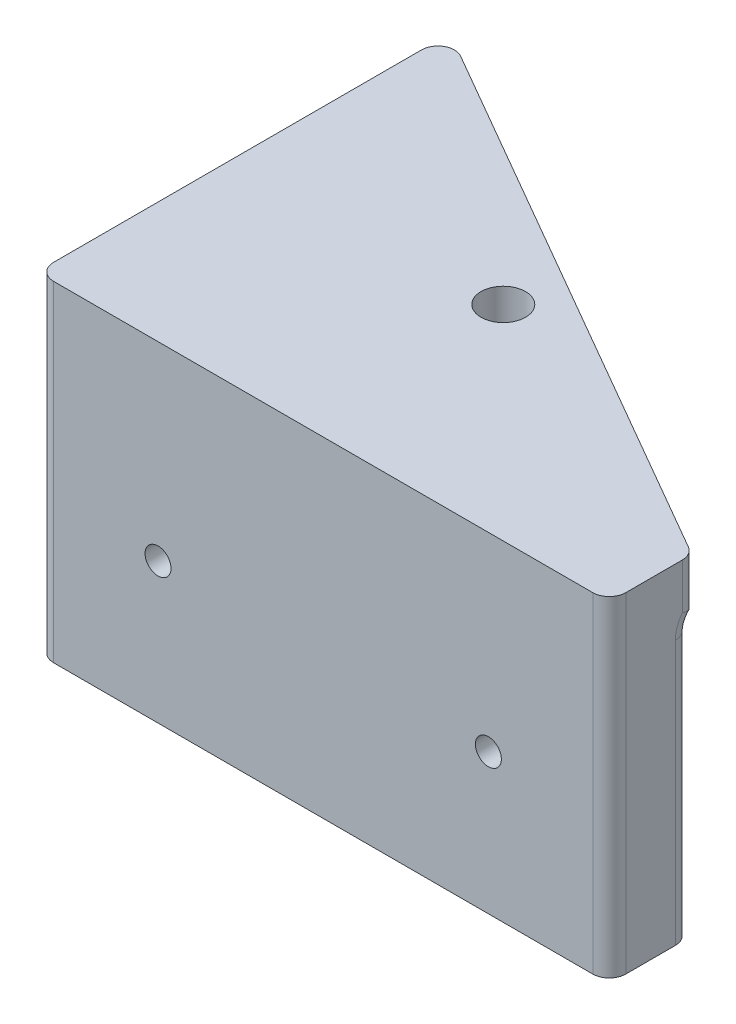
ISO-10303-21;
HEADER;
FILE_DESCRIPTION(('STEP AP214'),'2;1');
FILE_NAME('part.step','',(''),(''),'','','');
FILE_SCHEMA(('AUTOMOTIVE_DESIGN { 1 0 10303 214 1 1 1 1 }'));
ENDSEC;
DATA;
#1=APPLICATION_CONTEXT('core data for automotive mechanical design processes');
#2=APPLICATION_PROTOCOL_DEFINITION('international standard','automotive_design',2000,#1);
#3=PRODUCT_CONTEXT('',#1,'mechanical');
#4=PRODUCT('Part','Part','',(#3));
#5=PRODUCT_RELATED_PRODUCT_CATEGORY('part','',(#4));
#6=PRODUCT_DEFINITION_FORMATION('','',#4);
#7=PRODUCT_DEFINITION_CONTEXT('part definition',#1,'design');
#8=PRODUCT_DEFINITION('design','',#6,#7);
#9=PRODUCT_DEFINITION_SHAPE('','',#8);
#10=(LENGTH_UNIT() NAMED_UNIT(*) SI_UNIT(.MILLI.,.METRE.));
#11=(NAMED_UNIT(*) PLANE_ANGLE_UNIT() SI_UNIT($,.RADIAN.));
#12=(NAMED_UNIT(*) SI_UNIT($,.STERADIAN.) SOLID_ANGLE_UNIT());
#13=UNCERTAINTY_MEASURE_WITH_UNIT(LENGTH_MEASURE(1.E-05),#10,'distance_accuracy_value','');
#14=(GEOMETRIC_REPRESENTATION_CONTEXT(3) GLOBAL_UNCERTAINTY_ASSIGNED_CONTEXT((#13)) GLOBAL_UNIT_ASSIGNED_CONTEXT((#10,
#11,#12)) REPRESENTATION_CONTEXT('',''));
#15=CARTESIAN_POINT('',(0.,0.,0.));
#16=DIRECTION('',(0.,0.,1.));
#17=DIRECTION('',(1.,0.,0.));
#18=AXIS2_PLACEMENT_3D('',#15,#16,#17);
#19=CARTESIAN_POINT('',(0.,50.8,0.));
#20=DIRECTION('',(0.,1.,0.));
#21=DIRECTION('',(0.,0.,1.));
#22=AXIS2_PLACEMENT_3D('',#19,#20,#21);
#23=PLANE('',#22);
#24=DIRECTION('',(1.,0.,0.));
#25=VECTOR('',#24,1.);
#26=CARTESIAN_POINT('',(0.,50.8,0.));
#27=LINE('',#26,#25);
#28=CARTESIAN_POINT('',(2.54,50.8,0.));
#29=VERTEX_POINT('',#28);
#30=CARTESIAN_POINT('',(85.4481810244992,50.8,0.));
#31=VERTEX_POINT('',#30);
#32=EDGE_CURVE('E317',#29,#31,#27,.T.);
#33=ORIENTED_EDGE('',*,*,#32,.T.);
#34=CARTESIAN_POINT('',(85.4481810244992,50.8,-2.54));
#35=DIRECTION('',(0.,1.,0.));
#36=DIRECTION('',(0.,0.,1.));
#37=AXIS2_PLACEMENT_3D('',#34,#35,#36);
#38=CIRCLE('',#37,2.54);
#39=CARTESIAN_POINT('',(87.9881810244993,50.8,-2.54));
#40=VERTEX_POINT('',#39);
#41=EDGE_CURVE('E196',#31,#40,#38,.T.);
#42=ORIENTED_EDGE('',*,*,#41,.T.);
#43=DIRECTION('',(0.,0.,-1.));
#44=VECTOR('',#43,1.);
#45=CARTESIAN_POINT('',(87.9881810244993,50.8,0.));
#46=LINE('',#45,#44);
#47=CARTESIAN_POINT('',(87.9881810244993,50.8,-11.2335303162582));
#48=VERTEX_POINT('',#47);
#49=EDGE_CURVE('E321',#40,#48,#46,.T.);
#50=ORIENTED_EDGE('',*,*,#49,.T.);
#51=CARTESIAN_POINT('',(85.4481810244992,50.8,-11.2335303162582));
#52=DIRECTION('',(0.,1.,0.));
#53=DIRECTION('',(0.,0.,1.));
#54=AXIS2_PLACEMENT_3D('',#51,#52,#53);
#55=CIRCLE('',#54,2.54);
#56=CARTESIAN_POINT('',(86.7181810244992,50.8,-13.4332348418707));
#57=VERTEX_POINT('',#56);
#58=EDGE_CURVE('E192',#48,#57,#55,.T.);
#59=ORIENTED_EDGE('',*,*,#58,.T.);
#60=DIRECTION('',(-0.866025403784442,0.,-0.499999999999995));
#61=VECTOR('',#60,1.);
#62=CARTESIAN_POINT('',(87.9881810244993,50.8,-12.6999999999999));
#63=LINE('',#62,#61);
#64=CARTESIAN_POINT('',(3.80999999999998,50.8,-61.3002954743869));
#65=VERTEX_POINT('',#64);
#66=EDGE_CURVE('E267',#57,#65,#63,.T.);
#67=ORIENTED_EDGE('',*,*,#66,.T.);
#68=CARTESIAN_POINT('',(2.53999999999999,50.8,-59.1005909487744));
#69=DIRECTION('',(0.,1.,0.));
#70=DIRECTION('',(0.,0.,1.));
#71=AXIS2_PLACEMENT_3D('',#68,#69,#70);
#72=CIRCLE('',#71,2.54);
#73=CARTESIAN_POINT('',(0.,50.8,-59.1005909487744));
#74=VERTEX_POINT('',#73);
#75=EDGE_CURVE('E190',#65,#74,#72,.T.);
#76=ORIENTED_EDGE('',*,*,#75,.T.);
#77=DIRECTION('',(0.,0.,1.));
#78=VECTOR('',#77,1.);
#79=CARTESIAN_POINT('',(0.,50.8,-63.4999999999993));
#80=LINE('',#79,#78);
#81=CARTESIAN_POINT('',(0.,50.8,-2.54));
#82=VERTEX_POINT('',#81);
#83=EDGE_CURVE('E314',#74,#82,#80,.T.);
#84=ORIENTED_EDGE('',*,*,#83,.T.);
#85=CARTESIAN_POINT('',(2.54,50.8,-2.54));
#86=DIRECTION('',(0.,1.,0.));
#87=DIRECTION('',(0.,0.,1.));
#88=AXIS2_PLACEMENT_3D('',#85,#86,#87);
#89=CIRCLE('',#88,2.54);
#90=EDGE_CURVE('E194',#82,#29,#89,.T.);
#91=ORIENTED_EDGE('',*,*,#90,.T.);
#92=EDGE_LOOP('',(#33,#42,#50,#59,#67,#76,#84,#91));
#93=FACE_BOUND('',#92,.T.);
#94=CARTESIAN_POINT('',(40.1840905122497,50.8,-31.5008864231622));
#95=DIRECTION('',(0.,1.,0.));
#96=DIRECTION('',(0.,0.,1.));
#97=AXIS2_PLACEMENT_3D('',#94,#95,#96);
#98=CIRCLE('',#97,3.42900000000001);
#99=CARTESIAN_POINT('',(40.1840905122497,50.8,-28.0718864231622));
#100=VERTEX_POINT('',#99);
#101=EDGE_CURVE('E161',#100,#100,#98,.T.);
#102=ORIENTED_EDGE('',*,*,#101,.F.);
#103=EDGE_LOOP('',(#102));
#104=FACE_BOUND('',#103,.T.);
#105=ADVANCED_FACE('F35',(#93,#104),#23,.T.);
#106=CARTESIAN_POINT('',(0.,0.,0.));
#107=DIRECTION('',(0.,1.,0.));
#108=DIRECTION('',(0.,0.,1.));
#109=AXIS2_PLACEMENT_3D('',#106,#107,#108);
#110=PLANE('',#109);
#111=DIRECTION('',(1.,0.,0.));
#112=VECTOR('',#111,1.);
#113=CARTESIAN_POINT('',(0.,0.,-12.6999999999996));
#114=LINE('',#113,#112);
#115=CARTESIAN_POINT('',(2.54,0.,-12.6999999999996));
#116=VERTEX_POINT('',#115);
#117=CARTESIAN_POINT('',(85.4481810244992,0.,-12.6999999999997));
#118=VERTEX_POINT('',#117);
#119=EDGE_CURVE('E282',#116,#118,#114,.T.);
#120=ORIENTED_EDGE('',*,*,#119,.T.);
#121=CARTESIAN_POINT('',(85.4481810244992,0.,-10.1599999999997));
#122=DIRECTION('',(0.,1.,0.));
#123=DIRECTION('',(0.,0.,1.));
#124=AXIS2_PLACEMENT_3D('',#121,#122,#123);
#125=CIRCLE('',#124,2.54);
#126=CARTESIAN_POINT('',(87.9881810244993,0.,-10.1599999999997));
#127=VERTEX_POINT('',#126);
#128=EDGE_CURVE('E174',#118,#127,#125,.F.);
#129=ORIENTED_EDGE('',*,*,#128,.T.);
#130=DIRECTION('',(0.,0.,-1.));
#131=VECTOR('',#130,1.);
#132=CARTESIAN_POINT('',(87.9881810244993,0.,0.));
#133=LINE('',#132,#131);
#134=CARTESIAN_POINT('',(87.9881810244993,0.,-2.54));
#135=VERTEX_POINT('',#134);
#136=EDGE_CURVE('E318',#135,#127,#133,.T.);
#137=ORIENTED_EDGE('',*,*,#136,.F.);
#138=CARTESIAN_POINT('',(85.4481810244992,0.,-2.54));
#139=DIRECTION('',(0.,1.,0.));
#140=DIRECTION('',(0.,0.,1.));
#141=AXIS2_PLACEMENT_3D('',#138,#139,#140);
#142=CIRCLE('',#141,2.54);
#143=CARTESIAN_POINT('',(85.4481810244992,0.,0.));
#144=VERTEX_POINT('',#143);
#145=EDGE_CURVE('E168',#135,#144,#142,.F.);
#146=ORIENTED_EDGE('',*,*,#145,.T.);
#147=DIRECTION('',(1.,0.,0.));
#148=VECTOR('',#147,1.);
#149=CARTESIAN_POINT('',(0.,0.,0.));
#150=LINE('',#149,#148);
#151=CARTESIAN_POINT('',(2.54,0.,0.));
#152=VERTEX_POINT('',#151);
#153=EDGE_CURVE('E160',#152,#144,#150,.T.);
#154=ORIENTED_EDGE('',*,*,#153,.F.);
#155=CARTESIAN_POINT('',(2.54,0.,-2.54));
#156=DIRECTION('',(0.,1.,0.));
#157=DIRECTION('',(0.,0.,1.));
#158=AXIS2_PLACEMENT_3D('',#155,#156,#157);
#159=CIRCLE('',#158,2.54);
#160=CARTESIAN_POINT('',(0.,0.,-2.54));
#161=VERTEX_POINT('',#160);
#162=EDGE_CURVE('E159',#152,#161,#159,.F.);
#163=ORIENTED_EDGE('',*,*,#162,.T.);
#164=DIRECTION('',(0.,0.,1.));
#165=VECTOR('',#164,1.);
#166=CARTESIAN_POINT('',(0.,0.,-63.4999999999993));
#167=LINE('',#166,#165);
#168=CARTESIAN_POINT('',(0.,0.,-10.1599999999996));
#169=VERTEX_POINT('',#168);
#170=EDGE_CURVE('E142',#169,#161,#167,.T.);
#171=ORIENTED_EDGE('',*,*,#170,.F.);
#172=CARTESIAN_POINT('',(2.54,0.,-10.1599999999996));
#173=DIRECTION('',(0.,1.,0.));
#174=DIRECTION('',(0.,0.,1.));
#175=AXIS2_PLACEMENT_3D('',#172,#173,#174);
#176=CIRCLE('',#175,2.54);
#177=EDGE_CURVE('E156',#169,#116,#176,.F.);
#178=ORIENTED_EDGE('',*,*,#177,.T.);
#179=EDGE_LOOP('',(#120,#129,#137,#146,#154,#163,#171,#178));
#180=FACE_BOUND('',#179,.T.);
#181=ADVANCED_FACE('F155',(#180),#110,.F.);
#182=CARTESIAN_POINT('',(0.,50.8,-63.4999999999993));
#183=DIRECTION('',(1.,0.,0.));
#184=DIRECTION('',(0.,0.,-1.));
#185=AXIS2_PLACEMENT_3D('',#182,#183,#184);
#186=PLANE('',#185);
#187=ORIENTED_EDGE('',*,*,#170,.T.);
#188=DIRECTION('',(0.,-1.,0.));
#189=VECTOR('',#188,1.);
#190=CARTESIAN_POINT('',(0.,50.8,-2.54));
#191=LINE('',#190,#189);
#192=EDGE_CURVE('E151',#161,#82,#191,.F.);
#193=ORIENTED_EDGE('',*,*,#192,.T.);
#194=ORIENTED_EDGE('',*,*,#83,.F.);
#195=DIRECTION('',(0.,-1.,0.));
#196=VECTOR('',#195,1.);
#197=CARTESIAN_POINT('',(0.,50.8,-59.1005909487744));
#198=LINE('',#197,#196);
#199=CARTESIAN_POINT('',(0.,45.72,-59.1005909487744));
#200=VERTEX_POINT('',#199);
#201=EDGE_CURVE('E264',#74,#200,#198,.T.);
#202=ORIENTED_EDGE('',*,*,#201,.T.);
#203=DIRECTION('',(0.,0.,1.));
#204=VECTOR('',#203,1.);
#205=CARTESIAN_POINT('',(0.,45.72,-63.4999999999993));
#206=LINE('',#205,#204);
#207=CARTESIAN_POINT('',(0.,45.72,-15.2399999999996));
#208=VERTEX_POINT('',#207);
#209=EDGE_CURVE('E259',#200,#208,#206,.T.);
#210=ORIENTED_EDGE('',*,*,#209,.T.);
#211=CARTESIAN_POINT('',(0.,40.64,-15.2399999999996));
#212=DIRECTION('',(1.,0.,0.));
#213=DIRECTION('',(0.,0.,-1.));
#214=AXIS2_PLACEMENT_3D('',#211,#212,#213);
#215=CIRCLE('',#214,5.08);
#216=CARTESIAN_POINT('',(0.,40.64,-10.1599999999996));
#217=VERTEX_POINT('',#216);
#218=EDGE_CURVE('E146',#217,#208,#215,.F.);
#219=ORIENTED_EDGE('',*,*,#218,.F.);
#220=DIRECTION('',(0.,-1.,0.));
#221=VECTOR('',#220,1.);
#222=CARTESIAN_POINT('',(0.,50.8,-10.1599999999996));
#223=LINE('',#222,#221);
#224=EDGE_CURVE('E139',#217,#169,#223,.T.);
#225=ORIENTED_EDGE('',*,*,#224,.T.);
#226=EDGE_LOOP('',(#187,#193,#194,#202,#210,#219,#225));
#227=FACE_BOUND('',#226,.T.);
#228=ADVANCED_FACE('F141',(#227),#186,.F.);
#229=CARTESIAN_POINT('',(0.,50.8,0.));
#230=DIRECTION('',(0.,0.,-1.));
#231=DIRECTION('',(-1.,0.,0.));
#232=AXIS2_PLACEMENT_3D('',#229,#230,#231);
#233=PLANE('',#232);
#234=CARTESIAN_POINT('',(69.3940905122496,21.59,0.));
#235=DIRECTION('',(0.,0.,-1.));
#236=DIRECTION('',(-1.,0.,0.));
#237=AXIS2_PLACEMENT_3D('',#234,#235,#236);
#238=CIRCLE('',#237,2.);
#239=CARTESIAN_POINT('',(67.3940905122496,21.59,0.));
#240=VERTEX_POINT('',#239);
#241=EDGE_CURVE('E294',#240,#240,#238,.T.);
#242=ORIENTED_EDGE('',*,*,#241,.T.);
#243=EDGE_LOOP('',(#242));
#244=FACE_BOUND('',#243,.T.);
#245=CARTESIAN_POINT('',(18.5940905122496,21.59,0.));
#246=DIRECTION('',(0.,0.,-1.));
#247=DIRECTION('',(-1.,0.,0.));
#248=AXIS2_PLACEMENT_3D('',#245,#246,#247);
#249=CIRCLE('',#248,2.);
#250=CARTESIAN_POINT('',(16.5940905122496,21.59,0.));
#251=VERTEX_POINT('',#250);
#252=EDGE_CURVE('E302',#251,#251,#249,.T.);
#253=ORIENTED_EDGE('',*,*,#252,.T.);
#254=EDGE_LOOP('',(#253));
#255=FACE_BOUND('',#254,.T.);
#256=ORIENTED_EDGE('',*,*,#153,.T.);
#257=DIRECTION('',(0.,-1.,0.));
#258=VECTOR('',#257,1.);
#259=CARTESIAN_POINT('',(85.4481810244992,50.8,0.));
#260=LINE('',#259,#258);
#261=EDGE_CURVE('E188',#144,#31,#260,.F.);
#262=ORIENTED_EDGE('',*,*,#261,.T.);
#263=ORIENTED_EDGE('',*,*,#32,.F.);
#264=DIRECTION('',(0.,-1.,0.));
#265=VECTOR('',#264,1.);
#266=CARTESIAN_POINT('',(2.54,50.8,0.));
#267=LINE('',#266,#265);
#268=EDGE_CURVE('E185',#29,#152,#267,.T.);
#269=ORIENTED_EDGE('',*,*,#268,.T.);
#270=EDGE_LOOP('',(#256,#262,#263,#269));
#271=FACE_BOUND('',#270,.T.);
#272=ADVANCED_FACE('F355',(#244,#255,#271),#233,.F.);
#273=CARTESIAN_POINT('',(87.9881810244993,50.8,0.));
#274=DIRECTION('',(-1.,0.,0.));
#275=DIRECTION('',(0.,0.,1.));
#276=AXIS2_PLACEMENT_3D('',#273,#274,#275);
#277=PLANE('',#276);
#278=ORIENTED_EDGE('',*,*,#49,.F.);
#279=DIRECTION('',(0.,-1.,0.));
#280=VECTOR('',#279,1.);
#281=CARTESIAN_POINT('',(87.9881810244993,50.8,-2.54));
#282=LINE('',#281,#280);
#283=EDGE_CURVE('E182',#40,#135,#282,.T.);
#284=ORIENTED_EDGE('',*,*,#283,.T.);
#285=ORIENTED_EDGE('',*,*,#136,.T.);
#286=DIRECTION('',(0.,-1.,0.));
#287=VECTOR('',#286,1.);
#288=CARTESIAN_POINT('',(87.9881810244993,50.8,-10.1599999999997));
#289=LINE('',#288,#287);
#290=CARTESIAN_POINT('',(87.9881810244993,40.64,-10.1599999999997));
#291=VERTEX_POINT('',#290);
#292=EDGE_CURVE('E180',#127,#291,#289,.F.);
#293=ORIENTED_EDGE('',*,*,#292,.T.);
#294=CARTESIAN_POINT('',(87.9881810244993,40.64,-15.2399999999997));
#295=DIRECTION('',(-1.,0.,0.));
#296=DIRECTION('',(0.,0.,1.));
#297=AXIS2_PLACEMENT_3D('',#294,#295,#296);
#298=CIRCLE('',#297,5.08);
#299=CARTESIAN_POINT('',(87.9881810244993,43.7632356096299,-11.2335303162582));
#300=VERTEX_POINT('',#299);
#301=EDGE_CURVE('E178',#291,#300,#298,.T.);
#302=ORIENTED_EDGE('',*,*,#301,.T.);
#303=DIRECTION('',(0.,-1.,0.));
#304=VECTOR('',#303,1.);
#305=CARTESIAN_POINT('',(87.9881810244993,50.8,-11.2335303162582));
#306=LINE('',#305,#304);
#307=EDGE_CURVE('E176',#300,#48,#306,.F.);
#308=ORIENTED_EDGE('',*,*,#307,.T.);
#309=EDGE_LOOP('',(#278,#284,#285,#293,#302,#308));
#310=FACE_BOUND('',#309,.T.);
#311=ADVANCED_FACE('F353',(#310),#277,.F.);
#312=CARTESIAN_POINT('',(87.9881810244993,50.8,-12.6999999999999));
#313=DIRECTION('',(-0.499999999999995,0.,0.866025403784442));
#314=DIRECTION('',(0.866025403784442,0.,0.499999999999995));
#315=AXIS2_PLACEMENT_3D('',#312,#313,#314);
#316=PLANE('',#315);
#317=ORIENTED_EDGE('',*,*,#66,.F.);
#318=DIRECTION('',(0.,-1.,0.));
#319=VECTOR('',#318,1.);
#320=CARTESIAN_POINT('',(86.7181810244992,50.8,-13.4332348418707));
#321=LINE('',#320,#319);
#322=CARTESIAN_POINT('',(86.7181810244992,43.18,-13.4332348418707));
#323=VERTEX_POINT('',#322);
#324=EDGE_CURVE('E200',#57,#323,#321,.T.);
#325=ORIENTED_EDGE('',*,*,#324,.T.);
#326=DIRECTION('',(0.,-1.,0.));
#327=VECTOR('',#326,1.);
#328=CARTESIAN_POINT('',(86.7181810244992,50.8,-13.4332348418707));
#329=LINE('',#328,#327);
#330=CARTESIAN_POINT('',(86.7181810244992,42.8831454886272,-13.4332348418707));
#331=VERTEX_POINT('',#330);
#332=EDGE_CURVE('E45',#323,#331,#329,.T.);
#333=ORIENTED_EDGE('',*,*,#332,.T.);
#334=CARTESIAN_POINT('',(86.7181810244992,42.8831454886272,-13.4332348418707));
#335=CARTESIAN_POINT('',(86.6452460534976,42.8629788052658,-13.4753438670118));
#336=CARTESIAN_POINT('',(86.5713400503954,42.8485134649241,-13.5180135177976));
#337=CARTESIAN_POINT('',(86.4228672570093,42.8292855963533,-13.6037343250264));
#338=CARTESIAN_POINT('',(86.3483044674593,42.8244831587943,-13.6467831716446));
#339=CARTESIAN_POINT('',(86.2002711005633,42.8227559070771,-13.7322502758711));
#340=CARTESIAN_POINT('',(86.1268005131077,42.8257168018723,-13.7746685393161));
#341=CARTESIAN_POINT('',(85.9801911965526,42.8377806516813,-13.8593134676949));
#342=CARTESIAN_POINT('',(85.9070528276112,42.8468891582399,-13.9015399246913));
#343=CARTESIAN_POINT('',(85.7695700632303,42.8687834759007,-13.9809156357155));
#344=CARTESIAN_POINT('',(85.7051601774449,42.8810416779184,-14.0181027006122));
#345=CARTESIAN_POINT('',(85.5764551369388,42.9090338510272,-14.0924105903945));
#346=CARTESIAN_POINT('',(85.5121636963692,42.9247907419927,-14.1295292709139));
#347=CARTESIAN_POINT('',(85.4481810244992,42.9419845047425,-14.1664696837415));
#348=B_SPLINE_CURVE_WITH_KNOTS('',3,(#334,#335,#336,#337,#338,#339,#340,#341,#342,#343,#344,
#345,#346,#347),.UNSPECIFIED.,.F.,.F.,(4,2,2,2,2,2,4),(0.,0.259262787841385,0.517452562734878,
0.77186270814214,1.02650290425092,1.25255689491902,1.48013790736877),.UNSPECIFIED.);
#349=CARTESIAN_POINT('',(85.4481810244992,42.9419845047425,-14.1664696837415));
#350=VERTEX_POINT('',#349);
#351=EDGE_CURVE('E51',#331,#350,#348,.T.);
#352=ORIENTED_EDGE('',*,*,#351,.T.);
#353=CARTESIAN_POINT('',(83.5887719732746,40.64,-15.2399999999997));
#354=DIRECTION('',(-0.499999999999995,0.,0.866025403784442));
#355=DIRECTION('',(-0.866025403784442,0.,-0.499999999999995));
#356=AXIS2_PLACEMENT_3D('',#353,#354,#355);
#357=ELLIPSE('',#356,5.08000000000004,2.54);
#358=CARTESIAN_POINT('',(83.5887719732746,43.18,-15.2399999999997));
#359=VERTEX_POINT('',#358);
#360=EDGE_CURVE('E11',#350,#359,#357,.T.);
#361=ORIENTED_EDGE('',*,*,#360,.T.);
#362=DIRECTION('',(-0.866025403784442,0.,-0.499999999999995));
#363=VECTOR('',#362,1.);
#364=CARTESIAN_POINT('',(87.9881810244993,43.18,-12.6999999999999));
#365=LINE('',#364,#363);
#366=CARTESIAN_POINT('',(3.80999999999998,43.18,-61.3002954743869));
#367=VERTEX_POINT('',#366);
#368=EDGE_CURVE('E309',#359,#367,#365,.T.);
#369=ORIENTED_EDGE('',*,*,#368,.T.);
#370=DIRECTION('',(0.,-1.,0.));
#371=VECTOR('',#370,1.);
#372=CARTESIAN_POINT('',(3.80999999999998,50.8,-61.3002954743869));
#373=LINE('',#372,#371);
#374=EDGE_CURVE('E198',#367,#65,#373,.F.);
#375=ORIENTED_EDGE('',*,*,#374,.T.);
#376=EDGE_LOOP('',(#317,#325,#333,#352,#361,#369,#375));
#377=FACE_BOUND('',#376,.T.);
#378=ADVANCED_FACE('F338',(#377),#316,.F.);
#379=CARTESIAN_POINT('',(40.1840905122497,50.8,-31.5008864231622));
#380=DIRECTION('',(0.,-1.,0.));
#381=DIRECTION('',(0.,0.,-1.));
#382=AXIS2_PLACEMENT_3D('',#379,#380,#381);
#383=CYLINDRICAL_SURFACE('',#382,3.42900000000001);
#384=CARTESIAN_POINT('',(40.1840905122497,43.18,-31.5008864231622));
#385=DIRECTION('',(0.,1.,0.));
#386=DIRECTION('',(0.,0.,1.));
#387=AXIS2_PLACEMENT_3D('',#384,#385,#386);
#388=CIRCLE('',#387,3.42900000000001);
#389=CARTESIAN_POINT('',(40.1840905122497,43.18,-28.0718864231622));
#390=VERTEX_POINT('',#389);
#391=EDGE_CURVE('E308',#390,#390,#388,.T.);
#392=ORIENTED_EDGE('',*,*,#391,.F.);
#393=EDGE_LOOP('',(#392));
#394=FACE_BOUND('',#393,.T.);
#395=ORIENTED_EDGE('',*,*,#101,.T.);
#396=EDGE_LOOP('',(#395));
#397=FACE_BOUND('',#396,.T.);
#398=ADVANCED_FACE('F335',(#394,#397),#383,.F.);
#399=CARTESIAN_POINT('',(0.,43.18,-12.6999999999996));
#400=DIRECTION('',(0.,1.,0.));
#401=DIRECTION('',(0.,0.,1.));
#402=AXIS2_PLACEMENT_3D('',#399,#400,#401);
#403=PLANE('',#402);
#404=ORIENTED_EDGE('',*,*,#391,.T.);
#405=EDGE_LOOP('',(#404));
#406=FACE_BOUND('',#405,.T.);
#407=DIRECTION('',(0.,0.,1.));
#408=VECTOR('',#407,1.);
#409=CARTESIAN_POINT('',(2.54,43.18,-12.6999999999996));
#410=LINE('',#409,#408);
#411=CARTESIAN_POINT('',(2.54,43.18,-15.2399999999996));
#412=VERTEX_POINT('',#411);
#413=CARTESIAN_POINT('',(2.53999999999999,43.18,-61.6405909487744));
#414=VERTEX_POINT('',#413);
#415=EDGE_CURVE('E260',#412,#414,#410,.F.);
#416=ORIENTED_EDGE('',*,*,#415,.T.);
#417=CARTESIAN_POINT('',(2.53999999999999,43.18,-59.1005909487744));
#418=DIRECTION('',(0.,1.,0.));
#419=DIRECTION('',(0.,0.,1.));
#420=AXIS2_PLACEMENT_3D('',#417,#418,#419);
#421=CIRCLE('',#420,2.54);
#422=EDGE_CURVE('E275',#414,#367,#421,.F.);
#423=ORIENTED_EDGE('',*,*,#422,.T.);
#424=ORIENTED_EDGE('',*,*,#368,.F.);
#425=DIRECTION('',(1.,0.,0.));
#426=VECTOR('',#425,1.);
#427=CARTESIAN_POINT('',(0.,43.18,-15.2399999999996));
#428=LINE('',#427,#426);
#429=EDGE_CURVE('E272',#359,#412,#428,.F.);
#430=ORIENTED_EDGE('',*,*,#429,.T.);
#431=EDGE_LOOP('',(#416,#423,#424,#430));
#432=FACE_BOUND('',#431,.T.);
#433=ADVANCED_FACE('F332',(#406,#432),#403,.F.);
#434=CARTESIAN_POINT('',(0.,43.18,-12.6999999999996));
#435=DIRECTION('',(0.,0.,1.));
#436=DIRECTION('',(1.,0.,0.));
#437=AXIS2_PLACEMENT_3D('',#434,#435,#436);
#438=PLANE('',#437);
#439=CARTESIAN_POINT('',(69.3940905122496,21.59,-12.6999999999997));
#440=DIRECTION('',(0.,0.,-1.));
#441=DIRECTION('',(-1.,0.,0.));
#442=AXIS2_PLACEMENT_3D('',#439,#440,#441);
#443=CIRCLE('',#442,2.);
#444=CARTESIAN_POINT('',(67.3940905122496,21.59,-12.6999999999997));
#445=VERTEX_POINT('',#444);
#446=EDGE_CURVE('E292',#445,#445,#443,.T.);
#447=ORIENTED_EDGE('',*,*,#446,.F.);
#448=EDGE_LOOP('',(#447));
#449=FACE_BOUND('',#448,.T.);
#450=CARTESIAN_POINT('',(18.5940905122496,21.59,-12.6999999999996));
#451=DIRECTION('',(0.,0.,-1.));
#452=DIRECTION('',(-1.,0.,0.));
#453=AXIS2_PLACEMENT_3D('',#450,#451,#452);
#454=CIRCLE('',#453,2.);
#455=CARTESIAN_POINT('',(16.5940905122496,21.59,-12.6999999999996));
#456=VERTEX_POINT('',#455);
#457=EDGE_CURVE('E299',#456,#456,#454,.T.);
#458=ORIENTED_EDGE('',*,*,#457,.F.);
#459=EDGE_LOOP('',(#458));
#460=FACE_BOUND('',#459,.T.);
#461=DIRECTION('',(1.,0.,0.));
#462=VECTOR('',#461,1.);
#463=CARTESIAN_POINT('',(87.9881810244993,40.64,-12.6999999999997));
#464=LINE('',#463,#462);
#465=CARTESIAN_POINT('',(2.54,40.64,-12.6999999999996));
#466=VERTEX_POINT('',#465);
#467=CARTESIAN_POINT('',(85.4481810244992,40.64,-12.6999999999997));
#468=VERTEX_POINT('',#467);
#469=EDGE_CURVE('E277',#466,#468,#464,.T.);
#470=ORIENTED_EDGE('',*,*,#469,.T.);
#471=DIRECTION('',(0.,-1.,0.));
#472=VECTOR('',#471,1.);
#473=CARTESIAN_POINT('',(85.4481810244992,43.18,-12.6999999999997));
#474=LINE('',#473,#472);
#475=EDGE_CURVE('E166',#468,#118,#474,.T.);
#476=ORIENTED_EDGE('',*,*,#475,.T.);
#477=ORIENTED_EDGE('',*,*,#119,.F.);
#478=DIRECTION('',(0.,-1.,0.));
#479=VECTOR('',#478,1.);
#480=CARTESIAN_POINT('',(2.54,43.18,-12.6999999999996));
#481=LINE('',#480,#479);
#482=EDGE_CURVE('E165',#116,#466,#481,.F.);
#483=ORIENTED_EDGE('',*,*,#482,.T.);
#484=EDGE_LOOP('',(#470,#476,#477,#483));
#485=FACE_BOUND('',#484,.T.);
#486=ADVANCED_FACE('F280',(#449,#460,#485),#438,.F.);
#487=CARTESIAN_POINT('',(18.5940905122496,21.59,0.));
#488=DIRECTION('',(0.,0.,-1.));
#489=DIRECTION('',(-1.,0.,0.));
#490=AXIS2_PLACEMENT_3D('',#487,#488,#489);
#491=CYLINDRICAL_SURFACE('',#490,2.);
#492=ORIENTED_EDGE('',*,*,#252,.F.);
#493=EDGE_LOOP('',(#492));
#494=FACE_BOUND('',#493,.T.);
#495=ORIENTED_EDGE('',*,*,#457,.T.);
#496=EDGE_LOOP('',(#495));
#497=FACE_BOUND('',#496,.T.);
#498=ADVANCED_FACE('F400',(#494,#497),#491,.F.);
#499=CARTESIAN_POINT('',(69.3940905122496,21.59,0.));
#500=DIRECTION('',(0.,0.,-1.));
#501=DIRECTION('',(-1.,0.,0.));
#502=AXIS2_PLACEMENT_3D('',#499,#500,#501);
#503=CYLINDRICAL_SURFACE('',#502,2.);
#504=ORIENTED_EDGE('',*,*,#241,.F.);
#505=EDGE_LOOP('',(#504));
#506=FACE_BOUND('',#505,.T.);
#507=ORIENTED_EDGE('',*,*,#446,.T.);
#508=EDGE_LOOP('',(#507));
#509=FACE_BOUND('',#508,.T.);
#510=ADVANCED_FACE('F395',(#506,#509),#503,.F.);
#511=CARTESIAN_POINT('',(85.4481810244992,43.18,-10.1599999999997));
#512=DIRECTION('',(0.,-1.,0.));
#513=DIRECTION('',(0.,0.,-1.));
#514=AXIS2_PLACEMENT_3D('',#511,#512,#513);
#515=CYLINDRICAL_SURFACE('',#514,2.54);
#516=ORIENTED_EDGE('',*,*,#128,.F.);
#517=ORIENTED_EDGE('',*,*,#475,.F.);
#518=CARTESIAN_POINT('',(85.4481810244992,40.64,-10.1599999999997));
#519=DIRECTION('',(0.,1.,0.));
#520=DIRECTION('',(0.,0.,1.));
#521=AXIS2_PLACEMENT_3D('',#518,#519,#520);
#522=CIRCLE('',#521,2.54);
#523=EDGE_CURVE('E39',#291,#468,#522,.T.);
#524=ORIENTED_EDGE('',*,*,#523,.F.);
#525=ORIENTED_EDGE('',*,*,#292,.F.);
#526=EDGE_LOOP('',(#516,#517,#524,#525));
#527=FACE_BOUND('',#526,.T.);
#528=ADVANCED_FACE('F393',(#527),#515,.T.);
#529=CARTESIAN_POINT('',(85.4481810244992,50.8,-11.2335303162582));
#530=DIRECTION('',(0.,-1.,0.));
#531=DIRECTION('',(0.,0.,-1.));
#532=AXIS2_PLACEMENT_3D('',#529,#530,#531);
#533=CYLINDRICAL_SURFACE('',#532,2.54);
#534=ORIENTED_EDGE('',*,*,#58,.F.);
#535=ORIENTED_EDGE('',*,*,#307,.F.);
#536=CARTESIAN_POINT('',(86.7181810244992,42.8831454886272,-13.4332348418707));
#537=CARTESIAN_POINT('',(86.7825228804878,42.9009265920222,-13.3960848729693));
#538=CARTESIAN_POINT('',(86.8449702237645,42.919768896171,-13.3562674583514));
#539=CARTESIAN_POINT('',(86.9657546523008,42.959263227134,-13.2716692006694));
#540=CARTESIAN_POINT('',(87.0240936464085,42.9799144033561,-13.2268906878837));
#541=CARTESIAN_POINT('',(87.1921921998484,43.0440011756459,-13.0859179189513));
#542=CARTESIAN_POINT('',(87.2954519370749,43.0896886317913,-12.9828422119695));
#543=CARTESIAN_POINT('',(87.482038335498,43.1846691494509,-12.7619071869464));
#544=CARTESIAN_POINT('',(87.5653950524597,43.2339566256405,-12.6440705751089));
#545=CARTESIAN_POINT('',(87.710834437529,43.334451981428,-12.3965403634581));
#546=CARTESIAN_POINT('',(87.7729049756395,43.3856609376101,-12.2668400562253));
#547=CARTESIAN_POINT('',(87.8681717296212,43.4822214745031,-12.0152623219161));
#548=CARTESIAN_POINT('',(87.9039519472089,43.5275325264257,-11.8943355406787));
#549=CARTESIAN_POINT('',(87.957198668619,43.6175274689082,-11.6484920954832));
#550=CARTESIAN_POINT('',(87.9747014574429,43.6622124276501,-11.5235838459444));
#551=CARTESIAN_POINT('',(87.9861414843531,43.7239390364138,-11.3472846376636));
#552=CARTESIAN_POINT('',(87.9879087892215,43.7415616207477,-11.296510513776));
#553=CARTESIAN_POINT('',(87.9881713191905,43.7604489976999,-11.2416347270665));
#554=CARTESIAN_POINT('',(87.9881810163444,43.761842720298,-11.2375826625981));
#555=CARTESIAN_POINT('',(87.9881810244993,43.7632356096299,-11.2335303162582));
#556=B_SPLINE_CURVE_WITH_KNOTS('',3,(#536,#537,#538,#539,#540,#541,#542,#543,#544,#545,#546,
#547,#548,#549,#550,#551,#552,#553,#554,#555),.UNSPECIFIED.,.F.,.F.,(4,2,2,2,2,2,2,2,2,4),(0.,
0.229013523642321,0.457919929733396,0.914255857522426,1.36989824632672,1.82579985461941,
2.22657081053299,2.62654462031825,2.7877963169873,2.80065147612888),.UNSPECIFIED.);
#557=EDGE_CURVE('E238',#331,#300,#556,.T.);
#558=ORIENTED_EDGE('',*,*,#557,.F.);
#559=ORIENTED_EDGE('',*,*,#332,.F.);
#560=ORIENTED_EDGE('',*,*,#324,.F.);
#561=EDGE_LOOP('',(#534,#535,#558,#559,#560));
#562=FACE_BOUND('',#561,.T.);
#563=ADVANCED_FACE('F236',(#562),#533,.T.);
#564=CARTESIAN_POINT('',(85.4481810244992,40.64,-15.2399999999997));
#565=DIRECTION('',(-1.,0.,0.));
#566=DIRECTION('',(0.,0.,1.));
#567=AXIS2_PLACEMENT_3D('',#564,#565,#566);
#568=TOROIDAL_SURFACE('',#567,5.08,2.54);
#569=ORIENTED_EDGE('',*,*,#301,.F.);
#570=ORIENTED_EDGE('',*,*,#523,.T.);
#571=CARTESIAN_POINT('',(85.4481810244992,40.64,-15.2399999999997));
#572=DIRECTION('',(-1.,0.,0.));
#573=DIRECTION('',(0.,0.,1.));
#574=AXIS2_PLACEMENT_3D('',#571,#572,#573);
#575=CIRCLE('',#574,2.54);
#576=EDGE_CURVE('E244',#350,#468,#575,.F.);
#577=ORIENTED_EDGE('',*,*,#576,.F.);
#578=ORIENTED_EDGE('',*,*,#351,.F.);
#579=ORIENTED_EDGE('',*,*,#557,.T.);
#580=EDGE_LOOP('',(#569,#570,#577,#578,#579));
#581=FACE_BOUND('',#580,.T.);
#582=ADVANCED_FACE('F208',(#581),#568,.T.);
#583=CARTESIAN_POINT('',(2.54,50.8,-10.1599999999996));
#584=DIRECTION('',(0.,-1.,0.));
#585=DIRECTION('',(0.,0.,-1.));
#586=AXIS2_PLACEMENT_3D('',#583,#584,#585);
#587=CYLINDRICAL_SURFACE('',#586,2.54);
#588=ORIENTED_EDGE('',*,*,#177,.F.);
#589=ORIENTED_EDGE('',*,*,#224,.F.);
#590=CARTESIAN_POINT('',(2.54,40.64,-10.1599999999996));
#591=DIRECTION('',(0.,1.,0.));
#592=DIRECTION('',(0.,0.,1.));
#593=AXIS2_PLACEMENT_3D('',#590,#591,#592);
#594=CIRCLE('',#593,2.54);
#595=EDGE_CURVE('E247',#466,#217,#594,.T.);
#596=ORIENTED_EDGE('',*,*,#595,.F.);
#597=ORIENTED_EDGE('',*,*,#482,.F.);
#598=EDGE_LOOP('',(#588,#589,#596,#597));
#599=FACE_BOUND('',#598,.T.);
#600=ADVANCED_FACE('F164',(#599),#587,.T.);
#601=CARTESIAN_POINT('',(0.,40.64,-15.2399999999996));
#602=DIRECTION('',(-1.,0.,0.));
#603=DIRECTION('',(0.,0.,1.));
#604=AXIS2_PLACEMENT_3D('',#601,#602,#603);
#605=CYLINDRICAL_SURFACE('',#604,2.54);
#606=ORIENTED_EDGE('',*,*,#576,.T.);
#607=ORIENTED_EDGE('',*,*,#469,.F.);
#608=CARTESIAN_POINT('',(2.54,40.64,-15.2399999999996));
#609=DIRECTION('',(1.,0.,0.));
#610=DIRECTION('',(0.,0.,-1.));
#611=AXIS2_PLACEMENT_3D('',#608,#609,#610);
#612=CIRCLE('',#611,2.54);
#613=EDGE_CURVE('E249',#412,#466,#612,.T.);
#614=ORIENTED_EDGE('',*,*,#613,.F.);
#615=ORIENTED_EDGE('',*,*,#429,.F.);
#616=ORIENTED_EDGE('',*,*,#360,.F.);
#617=EDGE_LOOP('',(#606,#607,#614,#615,#616));
#618=FACE_BOUND('',#617,.T.);
#619=ADVANCED_FACE('F228',(#618),#605,.F.);
#620=CARTESIAN_POINT('',(2.53999999999999,50.8,-59.1005909487744));
#621=DIRECTION('',(0.,-1.,0.));
#622=DIRECTION('',(0.,0.,-1.));
#623=AXIS2_PLACEMENT_3D('',#620,#621,#622);
#624=CYLINDRICAL_SURFACE('',#623,2.54);
#625=ORIENTED_EDGE('',*,*,#374,.F.);
#626=ORIENTED_EDGE('',*,*,#422,.F.);
#627=CARTESIAN_POINT('',(2.53999999999999,45.72,-59.1005909487744));
#628=DIRECTION('',(0.,-0.707106781186547,0.707106781186547));
#629=DIRECTION('',(0.,-0.707106781186547,-0.707106781186547));
#630=AXIS2_PLACEMENT_3D('',#627,#628,#629);
#631=ELLIPSE('',#630,3.59210244842766,2.54);
#632=EDGE_CURVE('E252',#200,#414,#631,.T.);
#633=ORIENTED_EDGE('',*,*,#632,.F.);
#634=ORIENTED_EDGE('',*,*,#201,.F.);
#635=ORIENTED_EDGE('',*,*,#75,.F.);
#636=EDGE_LOOP('',(#625,#626,#633,#634,#635));
#637=FACE_BOUND('',#636,.T.);
#638=ADVANCED_FACE('F224',(#637),#624,.T.);
#639=CARTESIAN_POINT('',(2.54,40.64,-15.2399999999996));
#640=DIRECTION('',(1.,0.,0.));
#641=DIRECTION('',(0.,0.,-1.));
#642=AXIS2_PLACEMENT_3D('',#639,#640,#641);
#643=TOROIDAL_SURFACE('',#642,5.08,2.54);
#644=ORIENTED_EDGE('',*,*,#595,.T.);
#645=ORIENTED_EDGE('',*,*,#218,.T.);
#646=CARTESIAN_POINT('',(2.54,45.72,-15.2399999999996));
#647=DIRECTION('',(0.,0.,1.));
#648=DIRECTION('',(1.,0.,0.));
#649=AXIS2_PLACEMENT_3D('',#646,#647,#648);
#650=CIRCLE('',#649,2.54);
#651=EDGE_CURVE('E255',#412,#208,#650,.F.);
#652=ORIENTED_EDGE('',*,*,#651,.F.);
#653=ORIENTED_EDGE('',*,*,#613,.T.);
#654=EDGE_LOOP('',(#644,#645,#652,#653));
#655=FACE_BOUND('',#654,.T.);
#656=ADVANCED_FACE('F220',(#655),#643,.T.);
#657=CARTESIAN_POINT('',(2.53999999999999,45.72,-63.4999999999993));
#658=DIRECTION('',(0.,0.,1.));
#659=DIRECTION('',(1.,0.,0.));
#660=AXIS2_PLACEMENT_3D('',#657,#658,#659);
#661=CYLINDRICAL_SURFACE('',#660,2.54);
#662=ORIENTED_EDGE('',*,*,#632,.T.);
#663=ORIENTED_EDGE('',*,*,#415,.F.);
#664=ORIENTED_EDGE('',*,*,#651,.T.);
#665=ORIENTED_EDGE('',*,*,#209,.F.);
#666=EDGE_LOOP('',(#662,#663,#664,#665));
#667=FACE_BOUND('',#666,.T.);
#668=ADVANCED_FACE('F216',(#667),#661,.T.);
#669=CARTESIAN_POINT('',(85.4481810244992,50.8,-2.54));
#670=DIRECTION('',(0.,-1.,0.));
#671=DIRECTION('',(0.,0.,-1.));
#672=AXIS2_PLACEMENT_3D('',#669,#670,#671);
#673=CYLINDRICAL_SURFACE('',#672,2.54);
#674=ORIENTED_EDGE('',*,*,#41,.F.);
#675=ORIENTED_EDGE('',*,*,#261,.F.);
#676=ORIENTED_EDGE('',*,*,#145,.F.);
#677=ORIENTED_EDGE('',*,*,#283,.F.);
#678=EDGE_LOOP('',(#674,#675,#676,#677));
#679=FACE_BOUND('',#678,.T.);
#680=ADVANCED_FACE('F219',(#679),#673,.T.);
#681=CARTESIAN_POINT('',(2.54,50.8,-2.54));
#682=DIRECTION('',(0.,-1.,0.));
#683=DIRECTION('',(0.,0.,-1.));
#684=AXIS2_PLACEMENT_3D('',#681,#682,#683);
#685=CYLINDRICAL_SURFACE('',#684,2.54);
#686=ORIENTED_EDGE('',*,*,#90,.F.);
#687=ORIENTED_EDGE('',*,*,#192,.F.);
#688=ORIENTED_EDGE('',*,*,#162,.F.);
#689=ORIENTED_EDGE('',*,*,#268,.F.);
#690=EDGE_LOOP('',(#686,#687,#688,#689));
#691=FACE_BOUND('',#690,.T.);
#692=ADVANCED_FACE('F37',(#691),#685,.T.);
#693=CLOSED_SHELL('',(#105,#181,#228,#272,#311,#378,#398,#433,#486,#498,#510,#528,#563,#582,
#600,#619,#638,#656,#668,#680,#692));
#694=MANIFOLD_SOLID_BREP('B2',#693);
#695=ADVANCED_BREP_SHAPE_REPRESENTATION('',(#18,#694),#14);
#696=SHAPE_DEFINITION_REPRESENTATION(#9,#695);
ENDSEC;
END-ISO-10303-21;
